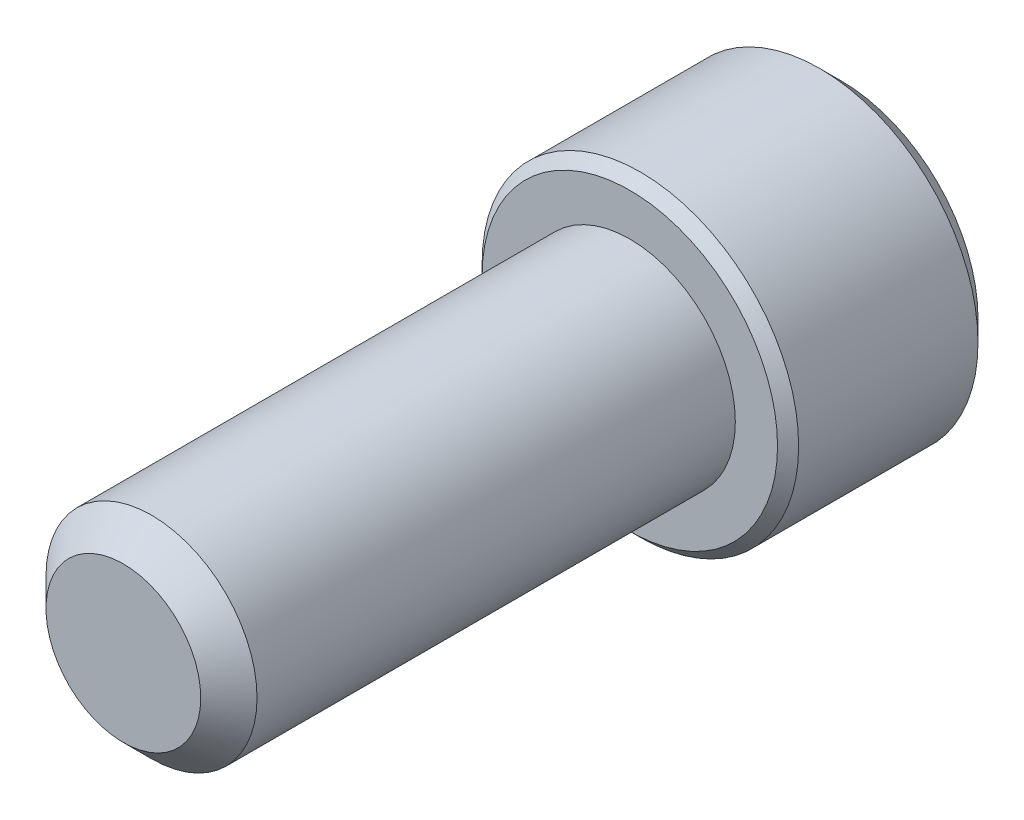
ISO-10303-21;
HEADER;
FILE_DESCRIPTION(('STEP AP214'),'2;1');
FILE_NAME('part.step','',(''),(''),'','','');
FILE_SCHEMA(('AUTOMOTIVE_DESIGN { 1 0 10303 214 1 1 1 1 }'));
ENDSEC;
DATA;
#1=APPLICATION_CONTEXT('core data for automotive mechanical design processes');
#2=APPLICATION_PROTOCOL_DEFINITION('international standard','automotive_design',2000,#1);
#3=PRODUCT_CONTEXT('',#1,'mechanical');
#4=PRODUCT('Part','Part','',(#3));
#5=PRODUCT_RELATED_PRODUCT_CATEGORY('part','',(#4));
#6=PRODUCT_DEFINITION_FORMATION('','',#4);
#7=PRODUCT_DEFINITION_CONTEXT('part definition',#1,'design');
#8=PRODUCT_DEFINITION('design','',#6,#7);
#9=PRODUCT_DEFINITION_SHAPE('','',#8);
#10=(LENGTH_UNIT() NAMED_UNIT(*) SI_UNIT(.MILLI.,.METRE.));
#11=(NAMED_UNIT(*) PLANE_ANGLE_UNIT() SI_UNIT($,.RADIAN.));
#12=(NAMED_UNIT(*) SI_UNIT($,.STERADIAN.) SOLID_ANGLE_UNIT());
#13=UNCERTAINTY_MEASURE_WITH_UNIT(LENGTH_MEASURE(1.E-05),#10,'distance_accuracy_value','');
#14=(GEOMETRIC_REPRESENTATION_CONTEXT(3) GLOBAL_UNCERTAINTY_ASSIGNED_CONTEXT((#13)) GLOBAL_UNIT_ASSIGNED_CONTEXT((#10,
#11,#12)) REPRESENTATION_CONTEXT('',''));
#15=CARTESIAN_POINT('',(0.,0.,0.));
#16=DIRECTION('',(0.,0.,1.));
#17=DIRECTION('',(1.,0.,0.));
#18=AXIS2_PLACEMENT_3D('',#15,#16,#17);
#19=CARTESIAN_POINT('',(0.,0.,-19.05));
#20=DIRECTION('',(0.,0.,1.));
#21=DIRECTION('',(1.,0.,0.));
#22=AXIS2_PLACEMENT_3D('',#19,#20,#21);
#23=CYLINDRICAL_SURFACE('',#22,3.96875);
#24=CARTESIAN_POINT('',(0.,0.,-1.05833333333334));
#25=DIRECTION('',(0.,0.,1.));
#26=DIRECTION('',(1.,0.,0.));
#27=AXIS2_PLACEMENT_3D('',#24,#25,#26);
#28=CIRCLE('',#27,3.96875);
#29=CARTESIAN_POINT('',(3.96875,0.,-1.05833333333334));
#30=VERTEX_POINT('',#29);
#31=EDGE_CURVE('E108',#30,#30,#28,.F.);
#32=CARTESIAN_POINT('',(0.,0.,-19.05));
#33=DIRECTION('',(0.,0.,-1.));
#34=DIRECTION('',(-1.,0.,0.));
#35=AXIS2_PLACEMENT_3D('',#32,#33,#34);
#36=CIRCLE('',#35,3.96875);
#37=CARTESIAN_POINT('',(3.96875,0.,-19.05));
#38=VERTEX_POINT('',#37);
#39=EDGE_CURVE('E211',#38,#38,#36,.F.);
#40=CARTESIAN_POINT('',(3.96875,0.,-1.05833333333334));
#41=CARTESIAN_POINT('',(3.96875,0.,-1.24574652777779));
#42=CARTESIAN_POINT('',(3.96875,0.,-1.43315972222223));
#43=CARTESIAN_POINT('',(3.96875,0.,-1.80798611111112));
#44=CARTESIAN_POINT('',(3.96875,0.,-1.99539930555556));
#45=CARTESIAN_POINT('',(3.96875,0.,-2.37022569444445));
#46=CARTESIAN_POINT('',(3.96875,0.,-2.5576388888889));
#47=CARTESIAN_POINT('',(3.96875,0.,-2.93246527777779));
#48=CARTESIAN_POINT('',(3.96875,0.,-3.11987847222223));
#49=CARTESIAN_POINT('',(3.96875,0.,-3.49470486111112));
#50=CARTESIAN_POINT('',(3.96875,0.,-3.68211805555556));
#51=CARTESIAN_POINT('',(3.96875,0.,-4.05694444444445));
#52=CARTESIAN_POINT('',(3.96875,0.,-4.24435763888889));
#53=CARTESIAN_POINT('',(3.96875,0.,-4.61918402777778));
#54=CARTESIAN_POINT('',(3.96875,0.,-4.80659722222223));
#55=CARTESIAN_POINT('',(3.96875,0.,-5.18142361111112));
#56=CARTESIAN_POINT('',(3.96875,0.,-5.36883680555556));
#57=CARTESIAN_POINT('',(3.96875,0.,-5.74366319444445));
#58=CARTESIAN_POINT('',(3.96875,0.,-5.93107638888889));
#59=CARTESIAN_POINT('',(3.96875,0.,-6.30590277777778));
#60=CARTESIAN_POINT('',(3.96875,0.,-6.49331597222223));
#61=CARTESIAN_POINT('',(3.96875,0.,-6.86814236111112));
#62=CARTESIAN_POINT('',(3.96875,0.,-7.05555555555556));
#63=CARTESIAN_POINT('',(3.96875,0.,-7.43038194444445));
#64=CARTESIAN_POINT('',(3.96875,0.,-7.61779513888889));
#65=CARTESIAN_POINT('',(3.96875,0.,-7.99262152777778));
#66=CARTESIAN_POINT('',(3.96875,0.,-8.18003472222223));
#67=CARTESIAN_POINT('',(3.96875,0.,-8.55486111111112));
#68=CARTESIAN_POINT('',(3.96875,0.,-8.74227430555556));
#69=CARTESIAN_POINT('',(3.96875,0.,-9.11710069444445));
#70=CARTESIAN_POINT('',(3.96875,0.,-9.30451388888889));
#71=CARTESIAN_POINT('',(3.96875,0.,-9.67934027777778));
#72=CARTESIAN_POINT('',(3.96875,0.,-9.86675347222222));
#73=CARTESIAN_POINT('',(3.96875,0.,-10.2415798611111));
#74=CARTESIAN_POINT('',(3.96875,0.,-10.4289930555556));
#75=CARTESIAN_POINT('',(3.96875,0.,-10.8038194444444));
#76=CARTESIAN_POINT('',(3.96875,0.,-10.9912326388889));
#77=CARTESIAN_POINT('',(3.96875,0.,-11.3660590277778));
#78=CARTESIAN_POINT('',(3.96875,0.,-11.5534722222222));
#79=CARTESIAN_POINT('',(3.96875,0.,-11.9282986111111));
#80=CARTESIAN_POINT('',(3.96875,0.,-12.1157118055556));
#81=CARTESIAN_POINT('',(3.96875,0.,-12.4905381944444));
#82=CARTESIAN_POINT('',(3.96875,0.,-12.6779513888889));
#83=CARTESIAN_POINT('',(3.96875,0.,-13.0527777777778));
#84=CARTESIAN_POINT('',(3.96875,0.,-13.2401909722222));
#85=CARTESIAN_POINT('',(3.96875,0.,-13.6150173611111));
#86=CARTESIAN_POINT('',(3.96875,0.,-13.8024305555556));
#87=CARTESIAN_POINT('',(3.96875,0.,-14.1772569444444));
#88=CARTESIAN_POINT('',(3.96875,0.,-14.3646701388889));
#89=CARTESIAN_POINT('',(3.96875,0.,-14.7394965277778));
#90=CARTESIAN_POINT('',(3.96875,0.,-14.9269097222222));
#91=CARTESIAN_POINT('',(3.96875,0.,-15.3017361111111));
#92=CARTESIAN_POINT('',(3.96875,0.,-15.4891493055556));
#93=CARTESIAN_POINT('',(3.96875,0.,-15.8639756944444));
#94=CARTESIAN_POINT('',(3.96875,0.,-16.0513888888889));
#95=CARTESIAN_POINT('',(3.96875,0.,-16.4262152777778));
#96=CARTESIAN_POINT('',(3.96875,0.,-16.6136284722222));
#97=CARTESIAN_POINT('',(3.96875,0.,-16.9884548611111));
#98=CARTESIAN_POINT('',(3.96875,0.,-17.1758680555556));
#99=CARTESIAN_POINT('',(3.96875,0.,-17.5506944444444));
#100=CARTESIAN_POINT('',(3.96875,0.,-17.7381076388889));
#101=CARTESIAN_POINT('',(3.96875,0.,-18.1129340277778));
#102=CARTESIAN_POINT('',(3.96875,0.,-18.3003472222222));
#103=CARTESIAN_POINT('',(3.96875,0.,-18.6751736111111));
#104=CARTESIAN_POINT('',(3.96875,0.,-18.8625868055556));
#105=CARTESIAN_POINT('',(3.96875,0.,-19.05));
#106=B_SPLINE_CURVE_WITH_KNOTS('',3,(#40,#41,#42,#43,#44,#45,#46,#47,#48,#49,#50,#51,#52,#53,
#54,#55,#56,#57,#58,#59,#60,#61,#62,#63,#64,#65,#66,#67,#68,#69,#70,#71,#72,#73,#74,#75,#76,#77,
#78,#79,#80,#81,#82,#83,#84,#85,#86,#87,#88,#89,#90,#91,#92,#93,#94,#95,#96,#97,#98,#99,#100,
#101,#102,#103,#104,#105),.UNSPECIFIED.,.F.,.F.,(4,2,2,2,2,2,2,2,2,2,2,2,2,2,2,2,2,2,2,2,2,2,2,
2,2,2,2,2,2,2,2,2,4),(0.,0.562239583333332,1.12447916666667,1.68671875,2.24895833333333,
2.81119791666666,3.3734375,3.93567708333333,4.49791666666666,5.06015625,5.62239583333333,
6.18463541666666,6.746875,7.30911458333333,7.87135416666666,8.43359374999999,8.99583333333333,
9.55807291666666,10.1203125,10.6825520833333,11.2447916666667,11.80703125,12.3692708333333,
12.9315104166667,13.49375,14.0559895833333,14.6182291666667,15.18046875,15.7427083333333,
16.3049479166667,16.8671875,17.4294270833333,17.9916666666667),.UNSPECIFIED.);
#107=EDGE_CURVE('BSEAM34',#30,#38,#106,.T.);
#108=ORIENTED_EDGE('',*,*,#31,.T.);
#109=ORIENTED_EDGE('',*,*,#39,.T.);
#110=ORIENTED_EDGE('',*,*,#107,.T.);
#111=ORIENTED_EDGE('',*,*,#107,.F.);
#112=EDGE_LOOP('',(#108,#110,#109,#111));
#113=FACE_BOUND('',#112,.T.);
#114=ADVANCED_FACE('F34',(#113),#23,.T.);
#115=CARTESIAN_POINT('',(0.,0.,0.));
#116=DIRECTION('',(0.,0.,1.));
#117=DIRECTION('',(1.,0.,0.));
#118=AXIS2_PLACEMENT_3D('',#115,#116,#117);
#119=PLANE('',#118);
#120=CARTESIAN_POINT('',(0.,0.,0.));
#121=DIRECTION('',(0.,0.,1.));
#122=DIRECTION('',(1.,0.,0.));
#123=AXIS2_PLACEMENT_3D('',#120,#121,#122);
#124=CIRCLE('',#123,2.91041666666666);
#125=CARTESIAN_POINT('',(2.91041666666666,0.,0.));
#126=VERTEX_POINT('',#125);
#127=EDGE_CURVE('E210',#126,#126,#124,.T.);
#128=ORIENTED_EDGE('',*,*,#127,.T.);
#129=EDGE_LOOP('',(#128));
#130=FACE_BOUND('',#129,.T.);
#131=ADVANCED_FACE('F188',(#130),#119,.T.);
#132=CARTESIAN_POINT('',(0.,0.,0.));
#133=DIRECTION('',(0.,0.,-1.));
#134=DIRECTION('',(-1.,0.,0.));
#135=AXIS2_PLACEMENT_3D('',#132,#133,#134);
#136=CONICAL_SURFACE('',#135,2.91041666666666,0.785398163397449);
#137=ORIENTED_EDGE('',*,*,#31,.F.);
#138=EDGE_LOOP('',(#137));
#139=FACE_BOUND('',#138,.T.);
#140=ORIENTED_EDGE('',*,*,#127,.F.);
#141=EDGE_LOOP('',(#140));
#142=FACE_BOUND('',#141,.T.);
#143=ADVANCED_FACE('F194',(#139,#142),#136,.T.);
#144=CARTESIAN_POINT('',(0.,0.,-26.9875));
#145=DIRECTION('',(0.,0.,1.));
#146=DIRECTION('',(1.,0.,0.));
#147=AXIS2_PLACEMENT_3D('',#144,#145,#146);
#148=CYLINDRICAL_SURFACE('',#147,5.953125);
#149=CARTESIAN_POINT('',(0.,0.,-19.446875));
#150=DIRECTION('',(0.,0.,-1.));
#151=DIRECTION('',(-1.,0.,0.));
#152=AXIS2_PLACEMENT_3D('',#149,#150,#151);
#153=CIRCLE('',#152,5.953125);
#154=CARTESIAN_POINT('',(-5.953125,0.,-19.446875));
#155=VERTEX_POINT('',#154);
#156=EDGE_CURVE('E42',#155,#155,#153,.T.);
#157=ORIENTED_EDGE('',*,*,#156,.T.);
#158=EDGE_LOOP('',(#157));
#159=FACE_BOUND('',#158,.T.);
#160=CARTESIAN_POINT('',(0.,0.,-26.19375));
#161=DIRECTION('',(0.,0.,-1.));
#162=DIRECTION('',(-1.,0.,0.));
#163=AXIS2_PLACEMENT_3D('',#160,#161,#162);
#164=CIRCLE('',#163,5.953125);
#165=CARTESIAN_POINT('',(-5.953125,0.,-26.19375));
#166=VERTEX_POINT('',#165);
#167=EDGE_CURVE('E171',#166,#166,#164,.F.);
#168=ORIENTED_EDGE('',*,*,#167,.T.);
#169=EDGE_LOOP('',(#168));
#170=FACE_BOUND('',#169,.T.);
#171=ADVANCED_FACE('F176',(#159,#170),#148,.T.);
#172=CARTESIAN_POINT('',(0.,0.,-26.9875));
#173=DIRECTION('',(0.,0.,-1.));
#174=DIRECTION('',(-1.,0.,0.));
#175=AXIS2_PLACEMENT_3D('',#172,#173,#174);
#176=PLANE('',#175);
#177=CARTESIAN_POINT('',(0.,0.,-26.9875));
#178=DIRECTION('',(0.,0.,-1.));
#179=DIRECTION('',(-1.,0.,0.));
#180=AXIS2_PLACEMENT_3D('',#177,#178,#179);
#181=CIRCLE('',#180,5.159375);
#182=CARTESIAN_POINT('',(-5.159375,0.,-26.9875));
#183=VERTEX_POINT('',#182);
#184=EDGE_CURVE('E107',#183,#183,#181,.T.);
#185=ORIENTED_EDGE('',*,*,#184,.T.);
#186=EDGE_LOOP('',(#185));
#187=FACE_BOUND('',#186,.T.);
#188=CARTESIAN_POINT('',(0.,0.,-26.9875));
#189=DIRECTION('',(0.,0.,-1.));
#190=DIRECTION('',(-1.,0.,0.));
#191=AXIS2_PLACEMENT_3D('',#188,#189,#190);
#192=CIRCLE('',#191,3.66617420935412);
#193=CARTESIAN_POINT('',(-3.175,1.83308710467706,-26.9875));
#194=VERTEX_POINT('',#193);
#195=CARTESIAN_POINT('',(0.,3.66617420935412,-26.9875));
#196=VERTEX_POINT('',#195);
#197=EDGE_CURVE('E88',#194,#196,#192,.T.);
#198=ORIENTED_EDGE('',*,*,#197,.F.);
#199=CARTESIAN_POINT('',(-3.175,-1.83308710467706,-26.9875));
#200=VERTEX_POINT('',#199);
#201=EDGE_CURVE('E48',#200,#194,#192,.T.);
#202=ORIENTED_EDGE('',*,*,#201,.F.);
#203=CARTESIAN_POINT('',(0.,-3.66617420935412,-26.9875));
#204=VERTEX_POINT('',#203);
#205=EDGE_CURVE('E270',#204,#200,#192,.T.);
#206=ORIENTED_EDGE('',*,*,#205,.F.);
#207=CARTESIAN_POINT('',(3.175,-1.83308710467706,-26.9875));
#208=VERTEX_POINT('',#207);
#209=EDGE_CURVE('E55',#208,#204,#192,.T.);
#210=ORIENTED_EDGE('',*,*,#209,.F.);
#211=CARTESIAN_POINT('',(3.175,1.83308710467706,-26.9875));
#212=VERTEX_POINT('',#211);
#213=EDGE_CURVE('E129',#212,#208,#192,.T.);
#214=ORIENTED_EDGE('',*,*,#213,.F.);
#215=EDGE_CURVE('E97',#196,#212,#192,.T.);
#216=ORIENTED_EDGE('',*,*,#215,.F.);
#217=EDGE_LOOP('',(#198,#202,#206,#210,#214,#216));
#218=FACE_BOUND('',#217,.T.);
#219=ADVANCED_FACE('F128',(#187,#218),#176,.T.);
#220=CARTESIAN_POINT('',(0.,0.,-19.05));
#221=DIRECTION('',(0.,0.,-1.));
#222=DIRECTION('',(-1.,0.,0.));
#223=AXIS2_PLACEMENT_3D('',#220,#221,#222);
#224=PLANE('',#223);
#225=CARTESIAN_POINT('',(0.,0.,-19.05));
#226=DIRECTION('',(0.,0.,-1.));
#227=DIRECTION('',(-1.,0.,0.));
#228=AXIS2_PLACEMENT_3D('',#225,#226,#227);
#229=CIRCLE('',#228,5.55625);
#230=CARTESIAN_POINT('',(-5.55625,0.,-19.05));
#231=VERTEX_POINT('',#230);
#232=EDGE_CURVE('E11',#231,#231,#229,.F.);
#233=ORIENTED_EDGE('',*,*,#232,.T.);
#234=EDGE_LOOP('',(#233));
#235=FACE_BOUND('',#234,.T.);
#236=ORIENTED_EDGE('',*,*,#39,.F.);
#237=EDGE_LOOP('',(#236));
#238=FACE_BOUND('',#237,.T.);
#239=ADVANCED_FACE('F282',(#235,#238),#224,.F.);
#240=CARTESIAN_POINT('',(0.,0.,-26.9875));
#241=DIRECTION('',(0.,0.,-1.));
#242=DIRECTION('',(-1.,0.,0.));
#243=AXIS2_PLACEMENT_3D('',#240,#241,#242);
#244=CONICAL_SURFACE('',#243,3.66617420935412,0.78539816339745);
#245=ORIENTED_EDGE('',*,*,#215,.T.);
#246=CARTESIAN_POINT('',(-0.000199999999999388,3.66628967940796,-26.9876154755089));
#247=CARTESIAN_POINT('',(0.108938349949826,3.60327862368552,-26.9246589836918));
#248=CARTESIAN_POINT('',(0.219901628077945,3.53921394518808,-26.8654001042347));
#249=CARTESIAN_POINT('',(0.446167846345947,3.40857908316254,-26.7568986557306));
#250=CARTESIAN_POINT('',(0.561492303252263,3.34199647692353,-26.7077164539387));
#251=CARTESIAN_POINT('',(0.794038522480626,3.207735854653,-26.623466458874));
#252=CARTESIAN_POINT('',(0.91120106628115,3.14009202845083,-26.5881869144995));
#253=CARTESIAN_POINT('',(1.14810544464628,3.00331522182952,-26.5338315701348));
#254=CARTESIAN_POINT('',(1.26784004264355,2.93418641944448,-26.5147151975296));
#255=CARTESIAN_POINT('',(1.47419791875158,2.81504564412411,-26.4974671306232));
#256=CARTESIAN_POINT('',(1.56055470772915,2.76518752876156,-26.4949139336138));
#257=CARTESIAN_POINT('',(1.73312781652471,2.66555239794355,-26.4992162731233));
#258=CARTESIAN_POINT('',(1.8193440764928,2.61577541704245,-26.5060751080214));
#259=CARTESIAN_POINT('',(1.99095979158713,2.51669303773558,-26.5288098833037));
#260=CARTESIAN_POINT('',(2.07635822425327,2.4673882296474,-26.5446959096873));
#261=CARTESIAN_POINT('',(2.24568840330547,2.36962540518969,-26.584617983998));
#262=CARTESIAN_POINT('',(2.32962026161975,2.32116732419836,-26.6086534070852));
#263=CARTESIAN_POINT('',(2.47862357928411,2.23514021863469,-26.6581052344172));
#264=CARTESIAN_POINT('',(2.54402485119173,2.19738077669348,-26.682221719301));
#265=CARTESIAN_POINT('',(2.67365325020511,2.12253978562849,-26.7343414671372));
#266=CARTESIAN_POINT('',(2.73788034144172,2.08545825721376,-26.7623448486035));
#267=CARTESIAN_POINT('',(2.8649580345126,2.01208991691129,-26.8216105655445));
#268=CARTESIAN_POINT('',(2.92781225074872,1.97580101824766,-26.8528626533542));
#269=CARTESIAN_POINT('',(3.05235662084809,1.90389529264474,-26.9182153443919));
#270=CARTESIAN_POINT('',(3.11404746097871,1.8682780694888,-26.9523141995185));
#271=CARTESIAN_POINT('',(3.1752,1.83297163462322,-26.9876154755089));
#272=B_SPLINE_CURVE_WITH_KNOTS('',3,(#246,#247,#248,#249,#250,#251,#252,#253,#254,#255,#256,
#257,#258,#259,#260,#261,#262,#263,#264,#265,#266,#267,#268,#269,#270,#271),.UNSPECIFIED.,.F.,
.F.,(4,2,2,2,2,2,2,2,2,2,2,2,4),(0.,0.422910572436807,0.848285055427807,1.26690402276127,
1.68446903107506,1.98329272958351,2.2822211754689,2.58148426995465,2.88072442418451,
3.11844134429546,3.35616551414405,3.59316134346766,3.8300126974443),.UNSPECIFIED.);
#273=EDGE_CURVE('E102',#196,#212,#272,.T.);
#274=ORIENTED_EDGE('',*,*,#273,.F.);
#275=EDGE_LOOP('',(#245,#274));
#276=FACE_BOUND('',#275,.T.);
#277=ADVANCED_FACE('F103',(#276),#244,.F.);
#278=ORIENTED_EDGE('',*,*,#213,.T.);
#279=CARTESIAN_POINT('',(3.175,-3.70444383584785,-28.2002118451619));
#280=CARTESIAN_POINT('',(3.175,-3.61446006856654,-28.1319043948676));
#281=CARTESIAN_POINT('',(3.175,-3.52397795214463,-28.0642428612445));
#282=CARTESIAN_POINT('',(3.175,-3.34181836123848,-27.9305025492024));
#283=CARTESIAN_POINT('',(3.175,-3.250140597284,-27.8644241654826));
#284=CARTESIAN_POINT('',(3.175,-3.06472035593929,-27.7336709408018));
#285=CARTESIAN_POINT('',(3.175,-2.97096738900307,-27.6690109250879));
#286=CARTESIAN_POINT('',(3.175,-2.78187869931257,-27.5420558022517));
#287=CARTESIAN_POINT('',(3.175,-2.68654308817008,-27.479760529372));
#288=CARTESIAN_POINT('',(3.175,-2.48836016870253,-27.3544784446062));
#289=CARTESIAN_POINT('',(3.175,-2.38540128536647,-27.2916672392123));
#290=CARTESIAN_POINT('',(3.175,-2.17707529026742,-27.1701078544743));
#291=CARTESIAN_POINT('',(3.175,-2.07170779370642,-27.111360330462));
#292=CARTESIAN_POINT('',(3.175,-1.85856318748113,-26.9991912176541));
#293=CARTESIAN_POINT('',(3.175,-1.75079438294671,-26.9457539709329));
#294=CARTESIAN_POINT('',(3.175,-1.53228582600746,-26.8454020450525));
#295=CARTESIAN_POINT('',(3.175,-1.4215474633634,-26.7984843761431));
#296=CARTESIAN_POINT('',(3.175,-1.20656057350991,-26.7165300344641));
#297=CARTESIAN_POINT('',(3.175,-1.10257181507286,-26.6808189415949));
#298=CARTESIAN_POINT('',(3.175,-0.892048260878874,-26.6177329725217));
#299=CARTESIAN_POINT('',(3.175,-0.785513294311069,-26.5903586572879));
#300=CARTESIAN_POINT('',(3.175,-0.572329012717401,-26.5458460023287));
#301=CARTESIAN_POINT('',(3.175,-0.465717564636563,-26.5285292889146));
#302=CARTESIAN_POINT('',(3.175,-0.251301383583128,-26.5044756602937));
#303=CARTESIAN_POINT('',(3.175,-0.143496870917778,-26.4977368235873));
#304=CARTESIAN_POINT('',(3.175,0.0681069951827486,-26.4953609564692));
#305=CARTESIAN_POINT('',(3.175,0.171901813638637,-26.4993091223896));
#306=CARTESIAN_POINT('',(3.175,0.378625872879022,-26.5171624071181));
#307=CARTESIAN_POINT('',(3.175,0.481555030095554,-26.5310684763143));
#308=CARTESIAN_POINT('',(3.175,0.687543944903104,-26.5683074222191));
#309=CARTESIAN_POINT('',(3.175,0.79057391174797,-26.5918024293294));
#310=CARTESIAN_POINT('',(3.175,0.994382635323685,-26.6469517792585));
#311=CARTESIAN_POINT('',(3.175,1.09516156281328,-26.6786055008759));
#312=CARTESIAN_POINT('',(3.175,1.30251417649916,-26.7516294931737));
#313=CARTESIAN_POINT('',(3.175,1.40887912364162,-26.7935863005657));
#314=CARTESIAN_POINT('',(3.175,1.61884111284846,-26.8839490627203));
#315=CARTESIAN_POINT('',(3.175,1.72243722600421,-26.9323571499939));
#316=CARTESIAN_POINT('',(3.175,1.92738358083041,-27.0344798355874));
#317=CARTESIAN_POINT('',(3.175,2.02872533588119,-27.088211328075));
#318=CARTESIAN_POINT('',(3.175,2.22907994672304,-27.1997921629552));
#319=CARTESIAN_POINT('',(3.175,2.32809316592035,-27.2576408570403));
#320=CARTESIAN_POINT('',(3.175,2.5192350372304,-27.3736949409625));
#321=CARTESIAN_POINT('',(3.175,2.61146147877822,-27.4317401210939));
#322=CARTESIAN_POINT('',(3.175,2.79433061473591,-27.550281230002));
#323=CARTESIAN_POINT('',(3.175,2.88497318880334,-27.610777343852));
#324=CARTESIAN_POINT('',(3.175,3.06414875022215,-27.7332851399095));
#325=CARTESIAN_POINT('',(3.175,3.1526928741123,-27.7952805926272));
#326=CARTESIAN_POINT('',(3.175,3.32856950185136,-27.9209183631728));
#327=CARTESIAN_POINT('',(3.175,3.41590233249716,-27.9845602229942));
#328=CARTESIAN_POINT('',(3.175,3.50272764399217,-28.0488754675913));
#329=B_SPLINE_CURVE_WITH_KNOTS('',3,(#279,#280,#281,#282,#283,#284,#285,#286,#287,#288,#289,
#290,#291,#292,#293,#294,#295,#296,#297,#298,#299,#300,#301,#302,#303,#304,#305,#306,#307,#308,
#309,#310,#311,#312,#313,#314,#315,#316,#317,#318,#319,#320,#321,#322,#323,#324,#325,#326,#327,
#328),.UNSPECIFIED.,.F.,.F.,(4,2,2,2,2,2,2,2,2,2,2,2,2,2,2,2,2,2,2,2,2,2,2,2,4),(0.,
0.338926722917917,0.67793708327951,1.01957183491538,1.36118259515686,1.72292567400707,
2.08472695420016,2.44542763005297,2.8059623458982,3.13552343983682,3.46510670458908,
3.78865064563718,4.11213580725537,4.42324708341662,4.73438805617943,5.05102342839298,
5.36763469922674,5.71039210015347,6.05326308403164,6.39725934486602,6.74120155829903,
7.06807292474687,7.39496901986434,7.71921932182542,8.04338037199419),.UNSPECIFIED.);
#330=EDGE_CURVE('E96',#212,#208,#329,.F.);
#331=ORIENTED_EDGE('',*,*,#330,.F.);
#332=EDGE_LOOP('',(#278,#331));
#333=FACE_BOUND('',#332,.T.);
#334=ADVANCED_FACE('F276',(#333),#244,.F.);
#335=ORIENTED_EDGE('',*,*,#209,.T.);
#336=CARTESIAN_POINT('',(3.1752,-1.83297163462322,-26.9876154755089));
#337=CARTESIAN_POINT('',(3.06606165005017,-1.89598269034567,-26.9246589836918));
#338=CARTESIAN_POINT('',(2.95509837192206,-1.9600473688431,-26.8654001042348));
#339=CARTESIAN_POINT('',(2.72883215365405,-2.09068223086865,-26.7568986557306));
#340=CARTESIAN_POINT('',(2.61350769674774,-2.15726483710766,-26.7077164539387));
#341=CARTESIAN_POINT('',(2.38096147751938,-2.29152545937818,-26.623466458874));
#342=CARTESIAN_POINT('',(2.26379893371885,-2.35916928558036,-26.5881869144995));
#343=CARTESIAN_POINT('',(2.02689455535372,-2.49594609220167,-26.5338315701348));
#344=CARTESIAN_POINT('',(1.90715995735645,-2.5650748945867,-26.5147151975296));
#345=CARTESIAN_POINT('',(1.70080208124842,-2.68421566990707,-26.4974671306233));
#346=CARTESIAN_POINT('',(1.61444529227085,-2.73407378526963,-26.4949139336138));
#347=CARTESIAN_POINT('',(1.44187218347529,-2.83370891608763,-26.4992162731233));
#348=CARTESIAN_POINT('',(1.3556559235072,-2.88348589698873,-26.5060751080214));
#349=CARTESIAN_POINT('',(1.18404020841287,-2.98256827629561,-26.5288098833037));
#350=CARTESIAN_POINT('',(1.09864177574673,-3.03187308438378,-26.5446959096873));
#351=CARTESIAN_POINT('',(0.929311596694529,-3.1296359088415,-26.584617983998));
#352=CARTESIAN_POINT('',(0.845379738380254,-3.17809398983283,-26.6086534070852));
#353=CARTESIAN_POINT('',(0.696376420715887,-3.2641210953965,-26.6581052344172));
#354=CARTESIAN_POINT('',(0.63097514880827,-3.30188053733771,-26.682221719301));
#355=CARTESIAN_POINT('',(0.501346749794896,-3.3767215284027,-26.7343414671372));
#356=CARTESIAN_POINT('',(0.437119658558279,-3.41380305681742,-26.7623448486035));
#357=CARTESIAN_POINT('',(0.310041965487402,-3.48717139711989,-26.8216105655445));
#358=CARTESIAN_POINT('',(0.247187749251278,-3.52346029578352,-26.8528626533542));
#359=CARTESIAN_POINT('',(0.122643379151908,-3.59536602138644,-26.9182153443919));
#360=CARTESIAN_POINT('',(0.0609525390212916,-3.63098324454239,-26.9523141995185));
#361=CARTESIAN_POINT('',(-0.000199999999998929,-3.66628967940796,-26.9876154755089));
#362=B_SPLINE_CURVE_WITH_KNOTS('',3,(#336,#337,#338,#339,#340,#341,#342,#343,#344,#345,#346,
#347,#348,#349,#350,#351,#352,#353,#354,#355,#356,#357,#358,#359,#360,#361),.UNSPECIFIED.,.F.,
.F.,(4,2,2,2,2,2,2,2,2,2,2,2,4),(0.,0.422910572436807,0.848285055427806,1.26690402276127,
1.68446903107506,1.98329272958351,2.2822211754689,2.58148426995465,2.88072442418451,
3.11844134429546,3.35616551414405,3.59316134346766,3.8300126974443),.UNSPECIFIED.);
#363=EDGE_CURVE('E139',#208,#204,#362,.T.);
#364=ORIENTED_EDGE('',*,*,#363,.F.);
#365=EDGE_LOOP('',(#335,#364));
#366=FACE_BOUND('',#365,.T.);
#367=ADVANCED_FACE('F273',(#366),#244,.F.);
#368=ORIENTED_EDGE('',*,*,#205,.T.);
#369=CARTESIAN_POINT('',(0.000199999999999886,-3.66628967940796,-26.9876154755089));
#370=CARTESIAN_POINT('',(-0.108938349949826,-3.60327862368552,-26.9246589836918));
#371=CARTESIAN_POINT('',(-0.219901628077944,-3.53921394518809,-26.8654001042347));
#372=CARTESIAN_POINT('',(-0.446167846345945,-3.40857908316254,-26.7568986557306));
#373=CARTESIAN_POINT('',(-0.56149230325226,-3.34199647692353,-26.7077164539387));
#374=CARTESIAN_POINT('',(-0.794038522480622,-3.207735854653,-26.623466458874));
#375=CARTESIAN_POINT('',(-0.911201066281146,-3.14009202845083,-26.5881869144995));
#376=CARTESIAN_POINT('',(-1.14810544464628,-3.00331522182952,-26.5338315701348));
#377=CARTESIAN_POINT('',(-1.26784004264355,-2.93418641944448,-26.5147151975296));
#378=CARTESIAN_POINT('',(-1.47419791875157,-2.81504564412412,-26.4974671306233));
#379=CARTESIAN_POINT('',(-1.56055470772915,-2.76518752876156,-26.4949139336138));
#380=CARTESIAN_POINT('',(-1.73312781652471,-2.66555239794355,-26.4992162731233));
#381=CARTESIAN_POINT('',(-1.8193440764928,-2.61577541704246,-26.5060751080214));
#382=CARTESIAN_POINT('',(-1.99095979158712,-2.51669303773558,-26.5288098833037));
#383=CARTESIAN_POINT('',(-2.07635822425327,-2.46738822964741,-26.5446959096873));
#384=CARTESIAN_POINT('',(-2.24568840330547,-2.36962540518969,-26.584617983998));
#385=CARTESIAN_POINT('',(-2.32962026161974,-2.32116732419836,-26.6086534070852));
#386=CARTESIAN_POINT('',(-2.47862357928411,-2.23514021863469,-26.6581052344172));
#387=CARTESIAN_POINT('',(-2.54402485119173,-2.19738077669348,-26.682221719301));
#388=CARTESIAN_POINT('',(-2.6736532502051,-2.12253978562849,-26.7343414671372));
#389=CARTESIAN_POINT('',(-2.73788034144172,-2.08545825721376,-26.7623448486035));
#390=CARTESIAN_POINT('',(-2.8649580345126,-2.01208991691129,-26.8216105655445));
#391=CARTESIAN_POINT('',(-2.92781225074872,-1.97580101824767,-26.8528626533542));
#392=CARTESIAN_POINT('',(-3.05235662084809,-1.90389529264474,-26.9182153443919));
#393=CARTESIAN_POINT('',(-3.11404746097871,-1.8682780694888,-26.9523141995185));
#394=CARTESIAN_POINT('',(-3.1752,-1.83297163462322,-26.9876154755089));
#395=B_SPLINE_CURVE_WITH_KNOTS('',3,(#369,#370,#371,#372,#373,#374,#375,#376,#377,#378,#379,
#380,#381,#382,#383,#384,#385,#386,#387,#388,#389,#390,#391,#392,#393,#394),.UNSPECIFIED.,.F.,
.F.,(4,2,2,2,2,2,2,2,2,2,2,2,4),(0.,0.422910572436807,0.848285055427803,1.26690402276127,
1.68446903107505,1.98329272958351,2.2822211754689,2.58148426995465,2.88072442418451,
3.11844134429545,3.35616551414405,3.59316134346766,3.8300126974443),.UNSPECIFIED.);
#396=EDGE_CURVE('E247',#204,#200,#395,.T.);
#397=ORIENTED_EDGE('',*,*,#396,.F.);
#398=EDGE_LOOP('',(#368,#397));
#399=FACE_BOUND('',#398,.T.);
#400=ADVANCED_FACE('F272',(#399),#244,.F.);
#401=ORIENTED_EDGE('',*,*,#201,.T.);
#402=CARTESIAN_POINT('',(-3.175,-3.70444383603083,-28.2002118453009));
#403=CARTESIAN_POINT('',(-3.175,-3.61446006874435,-28.1319043950012));
#404=CARTESIAN_POINT('',(-3.175,-3.52397795231724,-28.0642428613727));
#405=CARTESIAN_POINT('',(-3.175,-3.34181836140065,-27.93050254932));
#406=CARTESIAN_POINT('',(-3.175,-3.25014059744092,-27.8644241655949));
#407=CARTESIAN_POINT('',(-3.175,-3.06472035608553,-27.7336709409034));
#408=CARTESIAN_POINT('',(-3.175,-2.9709673891439,-27.6690109251841));
#409=CARTESIAN_POINT('',(-3.175,-2.78187869944244,-27.5420558023373));
#410=CARTESIAN_POINT('',(-3.175,-2.68654308829444,-27.4797605294523));
#411=CARTESIAN_POINT('',(-3.175,-2.48836016881498,-27.3544784446755));
#412=CARTESIAN_POINT('',(-3.175,-2.38540128547253,-27.291667239276));
#413=CARTESIAN_POINT('',(-3.175,-2.17707529036043,-27.1701078545269));
#414=CARTESIAN_POINT('',(-3.175,-2.0717077937928,-27.1113603305091));
#415=CARTESIAN_POINT('',(-3.175,-1.85856318755401,-26.9991912176908));
#416=CARTESIAN_POINT('',(-3.175,-1.75079438301272,-26.9457539709646));
#417=CARTESIAN_POINT('',(-3.175,-1.53228582605937,-26.8454020450749));
#418=CARTESIAN_POINT('',(-3.175,-1.42154746340806,-26.7984843761612));
#419=CARTESIAN_POINT('',(-3.175,-1.20656057355148,-26.716530034479));
#420=CARTESIAN_POINT('',(-3.175,-1.10257181511889,-26.6808189416102));
#421=CARTESIAN_POINT('',(-3.175,-0.892048260933981,-26.6177329725367));
#422=CARTESIAN_POINT('',(-3.175,-0.785513294370792,-26.5903586573024));
#423=CARTESIAN_POINT('',(-3.175,-0.572329012786206,-26.5458460023411));
#424=CARTESIAN_POINT('',(-3.175,-0.465717564709832,-26.5285292889253));
#425=CARTESIAN_POINT('',(-3.175,-0.251301383665185,-26.5044756603003));
#426=CARTESIAN_POINT('',(-3.175,-0.143496871004159,-26.4977368235914));
#427=CARTESIAN_POINT('',(-3.175,0.0681069950885757,-26.4953609564673));
#428=CARTESIAN_POINT('',(-3.175,0.171901813540984,-26.4993091223845));
#429=CARTESIAN_POINT('',(-3.175,0.378625872774768,-26.5171624071059));
#430=CARTESIAN_POINT('',(-3.175,0.481555029988179,-26.5310684762983));
#431=CARTESIAN_POINT('',(-3.175,0.687543944789567,-26.5683074221952));
#432=CARTESIAN_POINT('',(-3.175,0.790573911631402,-26.5918024293013));
#433=CARTESIAN_POINT('',(-3.175,0.994382635201358,-26.646951779222));
#434=CARTESIAN_POINT('',(-3.175,1.09516156268822,-26.6786055008352));
#435=CARTESIAN_POINT('',(-3.175,1.30251417635927,-26.7516294931208));
#436=CARTESIAN_POINT('',(-3.175,1.40887912348989,-26.7935863005044));
#437=CARTESIAN_POINT('',(-3.175,1.61884111267367,-26.8839490626411));
#438=CARTESIAN_POINT('',(-3.175,1.72243722581818,-26.9323571499053));
#439=CARTESIAN_POINT('',(-3.175,1.92738358062232,-27.0344798354796));
#440=CARTESIAN_POINT('',(-3.175,2.02872533566227,-27.0882113279573));
#441=CARTESIAN_POINT('',(-3.175,2.22907994648283,-27.1997921628173));
#442=CARTESIAN_POINT('',(-3.175,2.32809316566966,-27.2576408568921));
#443=CARTESIAN_POINT('',(-3.175,2.51923503696069,-27.3736949407949));
#444=CARTESIAN_POINT('',(-3.175,2.61146147849991,-27.4317401209171));
#445=CARTESIAN_POINT('',(-3.175,2.79433061444054,-27.5502812298069));
#446=CARTESIAN_POINT('',(-3.175,2.88497318849951,-27.6107773436477));
#447=CARTESIAN_POINT('',(-3.175,3.06414874990159,-27.7332851396869));
#448=CARTESIAN_POINT('',(-3.175,3.15269287378347,-27.7952805923955));
#449=CARTESIAN_POINT('',(-3.175,3.32856950150606,-27.9209183629229));
#450=CARTESIAN_POINT('',(-3.175,3.41590233214366,-27.9845602227352));
#451=CARTESIAN_POINT('',(-3.175,3.50272764363047,-28.0488754673233));
#452=B_SPLINE_CURVE_WITH_KNOTS('',3,(#402,#403,#404,#405,#406,#407,#408,#409,#410,#411,#412,
#413,#414,#415,#416,#417,#418,#419,#420,#421,#422,#423,#424,#425,#426,#427,#428,#429,#430,#431,
#432,#433,#434,#435,#436,#437,#438,#439,#440,#441,#442,#443,#444,#445,#446,#447,#448,#449,#450,
#451),.UNSPECIFIED.,.F.,.F.,(4,2,2,2,2,2,2,2,2,2,2,2,2,2,2,2,2,2,2,2,2,2,2,2,4),(0.,
0.338926722940017,0.677937083323712,1.0195718349821,1.36118259524609,1.72292567412158,
2.08472695433995,2.44542763021784,2.8059623460881,3.13552344001376,3.46510670475309,
3.78865064578881,4.11213580739461,4.4232470835451,4.73438805629713,5.05102342849905,
5.36763469932118,5.71039210020556,6.05326308404134,6.39725934483308,6.74120155822348,
7.06807292463488,7.3949690197159,7.71921932164103,8.04338037177386),.UNSPECIFIED.);
#453=EDGE_CURVE('E118',#200,#194,#452,.T.);
#454=ORIENTED_EDGE('',*,*,#453,.F.);
#455=EDGE_LOOP('',(#401,#454));
#456=FACE_BOUND('',#455,.T.);
#457=ADVANCED_FACE('F289',(#456),#244,.F.);
#458=ORIENTED_EDGE('',*,*,#197,.T.);
#459=CARTESIAN_POINT('',(-3.1752,1.83297163462322,-26.9876154755089));
#460=CARTESIAN_POINT('',(-3.06606165005018,1.89598269034567,-26.9246589836918));
#461=CARTESIAN_POINT('',(-2.95509837192206,1.9600473688431,-26.8654001042348));
#462=CARTESIAN_POINT('',(-2.72883215365406,2.09068223086865,-26.7568986557306));
#463=CARTESIAN_POINT('',(-2.61350769674774,2.15726483710766,-26.7077164539387));
#464=CARTESIAN_POINT('',(-2.38096147751937,2.29152545937818,-26.623466458874));
#465=CARTESIAN_POINT('',(-2.26379893371885,2.35916928558036,-26.5881869144995));
#466=CARTESIAN_POINT('',(-2.02689455535372,2.49594609220167,-26.5338315701348));
#467=CARTESIAN_POINT('',(-1.90715995735645,2.5650748945867,-26.5147151975296));
#468=CARTESIAN_POINT('',(-1.70080208124842,2.68421566990707,-26.4974671306232));
#469=CARTESIAN_POINT('',(-1.61444529227085,2.73407378526962,-26.4949139336138));
#470=CARTESIAN_POINT('',(-1.44187218347529,2.83370891608763,-26.4992162731233));
#471=CARTESIAN_POINT('',(-1.3556559235072,2.88348589698873,-26.5060751080214));
#472=CARTESIAN_POINT('',(-1.18404020841287,2.98256827629561,-26.5288098833037));
#473=CARTESIAN_POINT('',(-1.09864177574673,3.03187308438378,-26.5446959096873));
#474=CARTESIAN_POINT('',(-0.929311596694529,3.1296359088415,-26.584617983998));
#475=CARTESIAN_POINT('',(-0.845379738380254,3.17809398983283,-26.6086534070852));
#476=CARTESIAN_POINT('',(-0.696376420715887,3.2641210953965,-26.6581052344172));
#477=CARTESIAN_POINT('',(-0.630975148808269,3.3018805373377,-26.682221719301));
#478=CARTESIAN_POINT('',(-0.501346749794894,3.3767215284027,-26.7343414671372));
#479=CARTESIAN_POINT('',(-0.437119658558278,3.41380305681742,-26.7623448486035));
#480=CARTESIAN_POINT('',(-0.3100419654874,3.48717139711989,-26.8216105655445));
#481=CARTESIAN_POINT('',(-0.247187749251276,3.52346029578352,-26.8528626533542));
#482=CARTESIAN_POINT('',(-0.122643379151907,3.59536602138644,-26.9182153443919));
#483=CARTESIAN_POINT('',(-0.0609525390212901,3.63098324454239,-26.9523141995185));
#484=CARTESIAN_POINT('',(0.000200000000000005,3.66628967940796,-26.9876154755089));
#485=B_SPLINE_CURVE_WITH_KNOTS('',3,(#459,#460,#461,#462,#463,#464,#465,#466,#467,#468,#469,
#470,#471,#472,#473,#474,#475,#476,#477,#478,#479,#480,#481,#482,#483,#484),.UNSPECIFIED.,.F.,
.F.,(4,2,2,2,2,2,2,2,2,2,2,2,4),(0.,0.422910572436806,0.848285055427809,1.26690402276127,
1.68446903107506,1.98329272958351,2.2822211754689,2.58148426995465,2.88072442418452,
3.11844134429546,3.35616551414405,3.59316134346767,3.8300126974443),.UNSPECIFIED.);
#486=EDGE_CURVE('E92',#194,#196,#485,.T.);
#487=ORIENTED_EDGE('',*,*,#486,.F.);
#488=EDGE_LOOP('',(#458,#487));
#489=FACE_BOUND('',#488,.T.);
#490=ADVANCED_FACE('F90',(#489),#244,.F.);
#491=CARTESIAN_POINT('',(3.175,5.49926131403118,-22.225));
#492=DIRECTION('',(0.,0.,-1.));
#493=DIRECTION('',(-1.,0.,0.));
#494=AXIS2_PLACEMENT_3D('',#491,#492,#493);
#495=PLANE('',#494);
#496=DIRECTION('',(0.866025403784439,0.5,0.));
#497=VECTOR('',#496,1.);
#498=CARTESIAN_POINT('',(-3.175,1.83308710467706,-22.225));
#499=LINE('',#498,#497);
#500=CARTESIAN_POINT('',(-3.175,1.83308710467706,-22.225));
#501=VERTEX_POINT('',#500);
#502=CARTESIAN_POINT('',(0.,3.66617420935412,-22.225));
#503=VERTEX_POINT('',#502);
#504=EDGE_CURVE('E117',#501,#503,#499,.T.);
#505=ORIENTED_EDGE('',*,*,#504,.T.);
#506=DIRECTION('',(0.866025403784439,-0.5,0.));
#507=VECTOR('',#506,1.);
#508=CARTESIAN_POINT('',(0.,3.66617420935412,-22.225));
#509=LINE('',#508,#507);
#510=CARTESIAN_POINT('',(3.175,1.83308710467706,-22.225));
#511=VERTEX_POINT('',#510);
#512=EDGE_CURVE('E122',#503,#511,#509,.T.);
#513=ORIENTED_EDGE('',*,*,#512,.T.);
#514=DIRECTION('',(0.,-1.,0.));
#515=VECTOR('',#514,1.);
#516=CARTESIAN_POINT('',(3.175,1.83308710467706,-22.225));
#517=LINE('',#516,#515);
#518=CARTESIAN_POINT('',(3.175,-1.83308710467706,-22.225));
#519=VERTEX_POINT('',#518);
#520=EDGE_CURVE('E233',#511,#519,#517,.T.);
#521=ORIENTED_EDGE('',*,*,#520,.T.);
#522=DIRECTION('',(-0.866025403784439,-0.5,0.));
#523=VECTOR('',#522,1.);
#524=CARTESIAN_POINT('',(3.175,-1.83308710467706,-22.225));
#525=LINE('',#524,#523);
#526=CARTESIAN_POINT('',(0.,-3.66617420935412,-22.225));
#527=VERTEX_POINT('',#526);
#528=EDGE_CURVE('E230',#519,#527,#525,.T.);
#529=ORIENTED_EDGE('',*,*,#528,.T.);
#530=DIRECTION('',(-0.866025403784439,0.5,0.));
#531=VECTOR('',#530,1.);
#532=CARTESIAN_POINT('',(0.,-3.66617420935412,-22.225));
#533=LINE('',#532,#531);
#534=CARTESIAN_POINT('',(-3.175,-1.83308710467706,-22.225));
#535=VERTEX_POINT('',#534);
#536=EDGE_CURVE('E227',#527,#535,#533,.T.);
#537=ORIENTED_EDGE('',*,*,#536,.T.);
#538=DIRECTION('',(0.,1.,0.));
#539=VECTOR('',#538,1.);
#540=CARTESIAN_POINT('',(-3.175,-1.83308710467706,-22.225));
#541=LINE('',#540,#539);
#542=EDGE_CURVE('E125',#535,#501,#541,.T.);
#543=ORIENTED_EDGE('',*,*,#542,.T.);
#544=EDGE_LOOP('',(#505,#513,#521,#529,#537,#543));
#545=FACE_BOUND('',#544,.T.);
#546=ADVANCED_FACE('F159',(#545),#495,.T.);
#547=CARTESIAN_POINT('',(0.,3.66617420935412,-22.225));
#548=DIRECTION('',(0.5,0.866025403784439,0.));
#549=DIRECTION('',(-0.866025403784439,0.5,0.));
#550=AXIS2_PLACEMENT_3D('',#547,#548,#549);
#551=PLANE('',#550);
#552=DIRECTION('',(0.,0.,-1.));
#553=VECTOR('',#552,1.);
#554=CARTESIAN_POINT('',(0.,3.66617420935412,-22.225));
#555=LINE('',#554,#553);
#556=EDGE_CURVE('E114',#503,#196,#555,.T.);
#557=ORIENTED_EDGE('',*,*,#556,.T.);
#558=ORIENTED_EDGE('',*,*,#273,.T.);
#559=DIRECTION('',(0.,0.,-1.));
#560=VECTOR('',#559,1.);
#561=CARTESIAN_POINT('',(3.175,1.83308710467706,-22.225));
#562=LINE('',#561,#560);
#563=EDGE_CURVE('E124',#511,#212,#562,.T.);
#564=ORIENTED_EDGE('',*,*,#563,.F.);
#565=ORIENTED_EDGE('',*,*,#512,.F.);
#566=EDGE_LOOP('',(#557,#558,#564,#565));
#567=FACE_BOUND('',#566,.T.);
#568=ADVANCED_FACE('F120',(#567),#551,.F.);
#569=CARTESIAN_POINT('',(3.175,1.83308710467706,-22.225));
#570=DIRECTION('',(1.,0.,0.));
#571=DIRECTION('',(0.,1.,0.));
#572=AXIS2_PLACEMENT_3D('',#569,#570,#571);
#573=PLANE('',#572);
#574=ORIENTED_EDGE('',*,*,#563,.T.);
#575=ORIENTED_EDGE('',*,*,#330,.T.);
#576=DIRECTION('',(0.,0.,-1.));
#577=VECTOR('',#576,1.);
#578=CARTESIAN_POINT('',(3.175,-1.83308710467706,-22.225));
#579=LINE('',#578,#577);
#580=EDGE_CURVE('E216',#519,#208,#579,.T.);
#581=ORIENTED_EDGE('',*,*,#580,.F.);
#582=ORIENTED_EDGE('',*,*,#520,.F.);
#583=EDGE_LOOP('',(#574,#575,#581,#582));
#584=FACE_BOUND('',#583,.T.);
#585=ADVANCED_FACE('F148',(#584),#573,.F.);
#586=CARTESIAN_POINT('',(3.175,-1.83308710467706,-22.225));
#587=DIRECTION('',(0.5,-0.866025403784439,0.));
#588=DIRECTION('',(0.866025403784439,0.5,0.));
#589=AXIS2_PLACEMENT_3D('',#586,#587,#588);
#590=PLANE('',#589);
#591=ORIENTED_EDGE('',*,*,#580,.T.);
#592=ORIENTED_EDGE('',*,*,#363,.T.);
#593=DIRECTION('',(0.,0.,-1.));
#594=VECTOR('',#593,1.);
#595=CARTESIAN_POINT('',(0.,-3.66617420935412,-22.225));
#596=LINE('',#595,#594);
#597=EDGE_CURVE('E219',#527,#204,#596,.T.);
#598=ORIENTED_EDGE('',*,*,#597,.F.);
#599=ORIENTED_EDGE('',*,*,#528,.F.);
#600=EDGE_LOOP('',(#591,#592,#598,#599));
#601=FACE_BOUND('',#600,.T.);
#602=ADVANCED_FACE('F152',(#601),#590,.F.);
#603=CARTESIAN_POINT('',(0.,-3.66617420935412,-22.225));
#604=DIRECTION('',(-0.5,-0.866025403784439,0.));
#605=DIRECTION('',(0.866025403784439,-0.5,0.));
#606=AXIS2_PLACEMENT_3D('',#603,#604,#605);
#607=PLANE('',#606);
#608=ORIENTED_EDGE('',*,*,#597,.T.);
#609=ORIENTED_EDGE('',*,*,#396,.T.);
#610=DIRECTION('',(0.,0.,-1.));
#611=VECTOR('',#610,1.);
#612=CARTESIAN_POINT('',(-3.175,-1.83308710467706,-22.225));
#613=LINE('',#612,#611);
#614=EDGE_CURVE('E222',#535,#200,#613,.T.);
#615=ORIENTED_EDGE('',*,*,#614,.F.);
#616=ORIENTED_EDGE('',*,*,#536,.F.);
#617=EDGE_LOOP('',(#608,#609,#615,#616));
#618=FACE_BOUND('',#617,.T.);
#619=ADVANCED_FACE('F255',(#618),#607,.F.);
#620=CARTESIAN_POINT('',(-3.175,-1.83308710467706,-22.225));
#621=DIRECTION('',(-1.,0.,0.));
#622=DIRECTION('',(0.,-1.,0.));
#623=AXIS2_PLACEMENT_3D('',#620,#621,#622);
#624=PLANE('',#623);
#625=ORIENTED_EDGE('',*,*,#614,.T.);
#626=ORIENTED_EDGE('',*,*,#453,.T.);
#627=DIRECTION('',(0.,0.,-1.));
#628=VECTOR('',#627,1.);
#629=CARTESIAN_POINT('',(-3.175,1.83308710467706,-22.225));
#630=LINE('',#629,#628);
#631=EDGE_CURVE('E116',#501,#194,#630,.T.);
#632=ORIENTED_EDGE('',*,*,#631,.F.);
#633=ORIENTED_EDGE('',*,*,#542,.F.);
#634=EDGE_LOOP('',(#625,#626,#632,#633));
#635=FACE_BOUND('',#634,.T.);
#636=ADVANCED_FACE('F252',(#635),#624,.F.);
#637=CARTESIAN_POINT('',(-3.175,1.83308710467706,-22.225));
#638=DIRECTION('',(-0.5,0.866025403784439,0.));
#639=DIRECTION('',(-0.866025403784439,-0.5,0.));
#640=AXIS2_PLACEMENT_3D('',#637,#638,#639);
#641=PLANE('',#640);
#642=ORIENTED_EDGE('',*,*,#631,.T.);
#643=ORIENTED_EDGE('',*,*,#486,.T.);
#644=ORIENTED_EDGE('',*,*,#556,.F.);
#645=ORIENTED_EDGE('',*,*,#504,.F.);
#646=EDGE_LOOP('',(#642,#643,#644,#645));
#647=FACE_BOUND('',#646,.T.);
#648=ADVANCED_FACE('F112',(#647),#641,.F.);
#649=CARTESIAN_POINT('',(0.,0.,-26.9875));
#650=DIRECTION('',(0.,0.,1.));
#651=DIRECTION('',(1.,0.,0.));
#652=AXIS2_PLACEMENT_3D('',#649,#650,#651);
#653=CONICAL_SURFACE('',#652,5.159375,0.785398163397446);
#654=ORIENTED_EDGE('',*,*,#167,.F.);
#655=EDGE_LOOP('',(#654));
#656=FACE_BOUND('',#655,.T.);
#657=ORIENTED_EDGE('',*,*,#184,.F.);
#658=EDGE_LOOP('',(#657));
#659=FACE_BOUND('',#658,.T.);
#660=ADVANCED_FACE('F180',(#656,#659),#653,.T.);
#661=CARTESIAN_POINT('',(0.,0.,-19.446875));
#662=DIRECTION('',(0.,0.,-1.));
#663=DIRECTION('',(-1.,0.,0.));
#664=AXIS2_PLACEMENT_3D('',#661,#662,#663);
#665=CONICAL_SURFACE('',#664,5.953125,0.785398163397444);
#666=CARTESIAN_POINT('',(-5.55625,0.,-19.05));
#667=CARTESIAN_POINT('',(-5.56038411458333,0.,-19.0541341145833));
#668=CARTESIAN_POINT('',(-5.56451822916667,0.,-19.0582682291667));
#669=CARTESIAN_POINT('',(-5.57278645833333,0.,-19.0665364583333));
#670=CARTESIAN_POINT('',(-5.57692057291667,0.,-19.0706705729167));
#671=CARTESIAN_POINT('',(-5.58518880208333,0.,-19.0789388020833));
#672=CARTESIAN_POINT('',(-5.58932291666667,0.,-19.0830729166667));
#673=CARTESIAN_POINT('',(-5.59759114583333,0.,-19.0913411458333));
#674=CARTESIAN_POINT('',(-5.60172526041667,0.,-19.0954752604167));
#675=CARTESIAN_POINT('',(-5.60999348958333,0.,-19.1037434895833));
#676=CARTESIAN_POINT('',(-5.61412760416667,0.,-19.1078776041667));
#677=CARTESIAN_POINT('',(-5.62239583333333,0.,-19.1161458333333));
#678=CARTESIAN_POINT('',(-5.62652994791667,0.,-19.1202799479167));
#679=CARTESIAN_POINT('',(-5.63479817708333,0.,-19.1285481770833));
#680=CARTESIAN_POINT('',(-5.63893229166667,0.,-19.1326822916667));
#681=CARTESIAN_POINT('',(-5.64720052083333,0.,-19.1409505208333));
#682=CARTESIAN_POINT('',(-5.65133463541667,0.,-19.1450846354167));
#683=CARTESIAN_POINT('',(-5.65960286458333,0.,-19.1533528645833));
#684=CARTESIAN_POINT('',(-5.66373697916667,0.,-19.1574869791667));
#685=CARTESIAN_POINT('',(-5.67200520833333,0.,-19.1657552083333));
#686=CARTESIAN_POINT('',(-5.67613932291667,0.,-19.1698893229167));
#687=CARTESIAN_POINT('',(-5.68440755208333,0.,-19.1781575520833));
#688=CARTESIAN_POINT('',(-5.68854166666667,0.,-19.1822916666667));
#689=CARTESIAN_POINT('',(-5.69680989583333,0.,-19.1905598958333));
#690=CARTESIAN_POINT('',(-5.70094401041667,0.,-19.1946940104167));
#691=CARTESIAN_POINT('',(-5.70921223958333,0.,-19.2029622395833));
#692=CARTESIAN_POINT('',(-5.71334635416667,0.,-19.2070963541667));
#693=CARTESIAN_POINT('',(-5.72161458333333,0.,-19.2153645833333));
#694=CARTESIAN_POINT('',(-5.72574869791667,0.,-19.2194986979167));
#695=CARTESIAN_POINT('',(-5.73401692708333,0.,-19.2277669270833));
#696=CARTESIAN_POINT('',(-5.73815104166667,0.,-19.2319010416667));
#697=CARTESIAN_POINT('',(-5.74641927083333,0.,-19.2401692708333));
#698=CARTESIAN_POINT('',(-5.75055338541667,0.,-19.2443033854167));
#699=CARTESIAN_POINT('',(-5.75882161458333,0.,-19.2525716145833));
#700=CARTESIAN_POINT('',(-5.76295572916667,0.,-19.2567057291667));
#701=CARTESIAN_POINT('',(-5.77122395833333,0.,-19.2649739583333));
#702=CARTESIAN_POINT('',(-5.77535807291667,0.,-19.2691080729167));
#703=CARTESIAN_POINT('',(-5.78362630208333,0.,-19.2773763020833));
#704=CARTESIAN_POINT('',(-5.78776041666667,0.,-19.2815104166667));
#705=CARTESIAN_POINT('',(-5.79602864583333,0.,-19.2897786458333));
#706=CARTESIAN_POINT('',(-5.80016276041667,0.,-19.2939127604167));
#707=CARTESIAN_POINT('',(-5.80843098958333,0.,-19.3021809895833));
#708=CARTESIAN_POINT('',(-5.81256510416667,0.,-19.3063151041667));
#709=CARTESIAN_POINT('',(-5.82083333333333,0.,-19.3145833333333));
#710=CARTESIAN_POINT('',(-5.82496744791667,0.,-19.3187174479167));
#711=CARTESIAN_POINT('',(-5.83323567708333,0.,-19.3269856770833));
#712=CARTESIAN_POINT('',(-5.83736979166667,0.,-19.3311197916667));
#713=CARTESIAN_POINT('',(-5.84563802083333,0.,-19.3393880208333));
#714=CARTESIAN_POINT('',(-5.84977213541667,0.,-19.3435221354167));
#715=CARTESIAN_POINT('',(-5.85804036458333,0.,-19.3517903645833));
#716=CARTESIAN_POINT('',(-5.86217447916667,0.,-19.3559244791667));
#717=CARTESIAN_POINT('',(-5.87044270833333,0.,-19.3641927083333));
#718=CARTESIAN_POINT('',(-5.87457682291667,0.,-19.3683268229167));
#719=CARTESIAN_POINT('',(-5.88284505208333,0.,-19.3765950520833));
#720=CARTESIAN_POINT('',(-5.88697916666667,0.,-19.3807291666667));
#721=CARTESIAN_POINT('',(-5.89524739583333,0.,-19.3889973958333));
#722=CARTESIAN_POINT('',(-5.89938151041667,0.,-19.3931315104167));
#723=CARTESIAN_POINT('',(-5.90764973958333,0.,-19.4013997395833));
#724=CARTESIAN_POINT('',(-5.91178385416667,0.,-19.4055338541667));
#725=CARTESIAN_POINT('',(-5.92005208333333,0.,-19.4138020833333));
#726=CARTESIAN_POINT('',(-5.92418619791667,0.,-19.4179361979167));
#727=CARTESIAN_POINT('',(-5.93245442708333,0.,-19.4262044270833));
#728=CARTESIAN_POINT('',(-5.93658854166666,0.,-19.4303385416667));
#729=CARTESIAN_POINT('',(-5.94485677083333,0.,-19.4386067708333));
#730=CARTESIAN_POINT('',(-5.94899088541667,0.,-19.4427408854167));
#731=CARTESIAN_POINT('',(-5.953125,0.,-19.446875));
#732=B_SPLINE_CURVE_WITH_KNOTS('',3,(#666,#667,#668,#669,#670,#671,#672,#673,#674,#675,#676,
#677,#678,#679,#680,#681,#682,#683,#684,#685,#686,#687,#688,#689,#690,#691,#692,#693,#694,#695,
#696,#697,#698,#699,#700,#701,#702,#703,#704,#705,#706,#707,#708,#709,#710,#711,#712,#713,#714,
#715,#716,#717,#718,#719,#720,#721,#722,#723,#724,#725,#726,#727,#728,#729,#730,#731),
.UNSPECIFIED.,.F.,.F.,(4,2,2,2,2,2,2,2,2,2,2,2,2,2,2,2,2,2,2,2,2,2,2,2,2,2,2,2,2,2,2,2,4),(0.,
0.0175395627364622,0.0350791254729244,0.0526186882093896,0.0701582509458518,0.087697813682314,
0.105237376418779,0.122776939155241,0.140316501891704,0.157856064628168,0.17539562736463,
0.192935190101093,0.210474752837558,0.22801431557402,0.245553878310483,0.263093441046947,
0.28063300378341,0.298172566519872,0.315712129256336,0.333251691992799,0.350791254729261,
0.368330817465726,0.385870380202189,0.403409942938651,0.420949505675116,0.438489068411578,
0.45602863114804,0.473568193884505,0.491107756620968,0.50864731935743,0.526186882093895,
0.543726444830357,0.561266007566822),.UNSPECIFIED.);
#733=EDGE_CURVE('BSEAM36',#231,#155,#732,.T.);
#734=ORIENTED_EDGE('',*,*,#232,.F.);
#735=ORIENTED_EDGE('',*,*,#156,.F.);
#736=ORIENTED_EDGE('',*,*,#733,.T.);
#737=ORIENTED_EDGE('',*,*,#733,.F.);
#738=EDGE_LOOP('',(#734,#736,#735,#737));
#739=FACE_BOUND('',#738,.T.);
#740=ADVANCED_FACE('F36',(#739),#665,.T.);
#741=CLOSED_SHELL('',(#114,#131,#143,#171,#219,#239,#277,#334,#367,#400,#457,#490,#546,#568,
#585,#602,#619,#636,#648,#660,#740));
#742=MANIFOLD_SOLID_BREP('B2',#741);
#743=ADVANCED_BREP_SHAPE_REPRESENTATION('',(#18,#742),#14);
#744=SHAPE_DEFINITION_REPRESENTATION(#9,#743);
ENDSEC;
END-ISO-10303-21;
